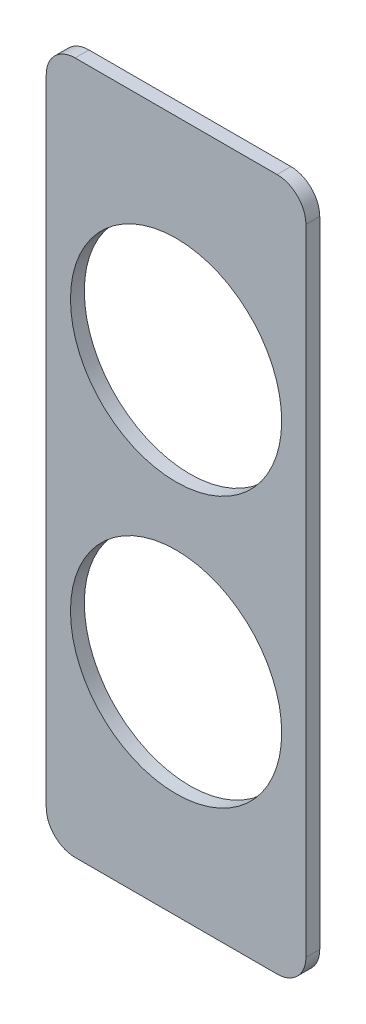
ISO-10303-21;
HEADER;
FILE_DESCRIPTION(('STEP AP214'),'2;1');
FILE_NAME('part.step','',(''),(''),'','','');
FILE_SCHEMA(('AUTOMOTIVE_DESIGN { 1 0 10303 214 1 1 1 1 }'));
ENDSEC;
DATA;
#1=APPLICATION_CONTEXT('core data for automotive mechanical design processes');
#2=APPLICATION_PROTOCOL_DEFINITION('international standard','automotive_design',2000,#1);
#3=PRODUCT_CONTEXT('',#1,'mechanical');
#4=PRODUCT('Part','Part','',(#3));
#5=PRODUCT_RELATED_PRODUCT_CATEGORY('part','',(#4));
#6=PRODUCT_DEFINITION_FORMATION('','',#4);
#7=PRODUCT_DEFINITION_CONTEXT('part definition',#1,'design');
#8=PRODUCT_DEFINITION('design','',#6,#7);
#9=PRODUCT_DEFINITION_SHAPE('','',#8);
#10=(LENGTH_UNIT() NAMED_UNIT(*) SI_UNIT(.MILLI.,.METRE.));
#11=(NAMED_UNIT(*) PLANE_ANGLE_UNIT() SI_UNIT($,.RADIAN.));
#12=(NAMED_UNIT(*) SI_UNIT($,.STERADIAN.) SOLID_ANGLE_UNIT());
#13=UNCERTAINTY_MEASURE_WITH_UNIT(LENGTH_MEASURE(1.E-05),#10,'distance_accuracy_value','');
#14=(GEOMETRIC_REPRESENTATION_CONTEXT(3) GLOBAL_UNCERTAINTY_ASSIGNED_CONTEXT((#13)) GLOBAL_UNIT_ASSIGNED_CONTEXT((#10,
#11,#12)) REPRESENTATION_CONTEXT('',''));
#15=CARTESIAN_POINT('',(0.,0.,0.));
#16=DIRECTION('',(0.,0.,1.));
#17=DIRECTION('',(1.,0.,0.));
#18=AXIS2_PLACEMENT_3D('',#15,#16,#17);
#19=CARTESIAN_POINT('',(-22.225,-69.85,-3.048));
#20=DIRECTION('',(0.,0.,1.));
#21=DIRECTION('',(1.,0.,0.));
#22=AXIS2_PLACEMENT_3D('',#19,#20,#21);
#23=CYLINDRICAL_SURFACE('',#22,6.35);
#24=CARTESIAN_POINT('',(-22.225,-69.85,0.));
#25=DIRECTION('',(0.,0.,1.));
#26=DIRECTION('',(1.,0.,0.));
#27=AXIS2_PLACEMENT_3D('',#24,#25,#26);
#28=CIRCLE('',#27,6.35);
#29=CARTESIAN_POINT('',(-28.575,-69.85,0.));
#30=VERTEX_POINT('',#29);
#31=CARTESIAN_POINT('',(-22.225,-76.2,0.));
#32=VERTEX_POINT('',#31);
#33=EDGE_CURVE('E137',#30,#32,#28,.T.);
#34=ORIENTED_EDGE('',*,*,#33,.F.);
#35=DIRECTION('',(0.,0.,1.));
#36=VECTOR('',#35,1.);
#37=CARTESIAN_POINT('',(-28.575,-69.85,-3.048));
#38=LINE('',#37,#36);
#39=CARTESIAN_POINT('',(-28.575,-69.85,-3.048));
#40=VERTEX_POINT('',#39);
#41=EDGE_CURVE('E11',#40,#30,#38,.T.);
#42=ORIENTED_EDGE('',*,*,#41,.F.);
#43=CARTESIAN_POINT('',(-22.225,-69.85,-3.048));
#44=DIRECTION('',(0.,0.,1.));
#45=DIRECTION('',(1.,0.,0.));
#46=AXIS2_PLACEMENT_3D('',#43,#44,#45);
#47=CIRCLE('',#46,6.35);
#48=CARTESIAN_POINT('',(-22.225,-76.2,-3.048));
#49=VERTEX_POINT('',#48);
#50=EDGE_CURVE('E157',#40,#49,#47,.T.);
#51=ORIENTED_EDGE('',*,*,#50,.T.);
#52=DIRECTION('',(0.,0.,1.));
#53=VECTOR('',#52,1.);
#54=CARTESIAN_POINT('',(-22.225,-76.2,-3.048));
#55=LINE('',#54,#53);
#56=EDGE_CURVE('E42',#49,#32,#55,.T.);
#57=ORIENTED_EDGE('',*,*,#56,.T.);
#58=EDGE_LOOP('',(#34,#42,#51,#57));
#59=FACE_BOUND('',#58,.T.);
#60=ADVANCED_FACE('F41',(#59),#23,.T.);
#61=CARTESIAN_POINT('',(-28.575,69.8499999999999,-3.048));
#62=DIRECTION('',(-1.,0.,0.));
#63=DIRECTION('',(0.,-1.,0.));
#64=AXIS2_PLACEMENT_3D('',#61,#62,#63);
#65=PLANE('',#64);
#66=DIRECTION('',(0.,-1.,0.));
#67=VECTOR('',#66,1.);
#68=CARTESIAN_POINT('',(-28.575,69.8499999999999,0.));
#69=LINE('',#68,#67);
#70=CARTESIAN_POINT('',(-28.575,69.8499999999999,0.));
#71=VERTEX_POINT('',#70);
#72=EDGE_CURVE('E160',#71,#30,#69,.T.);
#73=ORIENTED_EDGE('',*,*,#72,.F.);
#74=DIRECTION('',(0.,0.,1.));
#75=VECTOR('',#74,1.);
#76=CARTESIAN_POINT('',(-28.575,69.8499999999999,-3.048));
#77=LINE('',#76,#75);
#78=CARTESIAN_POINT('',(-28.575,69.8499999999999,-3.048));
#79=VERTEX_POINT('',#78);
#80=EDGE_CURVE('E49',#79,#71,#77,.T.);
#81=ORIENTED_EDGE('',*,*,#80,.F.);
#82=DIRECTION('',(0.,-1.,0.));
#83=VECTOR('',#82,1.);
#84=CARTESIAN_POINT('',(-28.575,69.8499999999999,-3.048));
#85=LINE('',#84,#83);
#86=EDGE_CURVE('E126',#79,#40,#85,.T.);
#87=ORIENTED_EDGE('',*,*,#86,.T.);
#88=ORIENTED_EDGE('',*,*,#41,.T.);
#89=EDGE_LOOP('',(#73,#81,#87,#88));
#90=FACE_BOUND('',#89,.T.);
#91=ADVANCED_FACE('F174',(#90),#65,.T.);
#92=CARTESIAN_POINT('',(-22.225,69.85,-3.048));
#93=DIRECTION('',(0.,0.,1.));
#94=DIRECTION('',(1.,0.,0.));
#95=AXIS2_PLACEMENT_3D('',#92,#93,#94);
#96=CYLINDRICAL_SURFACE('',#95,6.35);
#97=CARTESIAN_POINT('',(-22.225,69.85,0.));
#98=DIRECTION('',(0.,0.,1.));
#99=DIRECTION('',(-1.,0.,0.));
#100=AXIS2_PLACEMENT_3D('',#97,#98,#99);
#101=CIRCLE('',#100,6.35);
#102=CARTESIAN_POINT('',(-22.225,76.2,0.));
#103=VERTEX_POINT('',#102);
#104=EDGE_CURVE('E113',#103,#71,#101,.T.);
#105=ORIENTED_EDGE('',*,*,#104,.F.);
#106=DIRECTION('',(0.,0.,1.));
#107=VECTOR('',#106,1.);
#108=CARTESIAN_POINT('',(-22.225,76.2,-3.048));
#109=LINE('',#108,#107);
#110=CARTESIAN_POINT('',(-22.225,76.2,-3.048));
#111=VERTEX_POINT('',#110);
#112=EDGE_CURVE('E109',#111,#103,#109,.T.);
#113=ORIENTED_EDGE('',*,*,#112,.F.);
#114=CARTESIAN_POINT('',(-22.225,69.85,-3.048));
#115=DIRECTION('',(0.,0.,1.));
#116=DIRECTION('',(-1.,0.,0.));
#117=AXIS2_PLACEMENT_3D('',#114,#115,#116);
#118=CIRCLE('',#117,6.35);
#119=EDGE_CURVE('E114',#111,#79,#118,.T.);
#120=ORIENTED_EDGE('',*,*,#119,.T.);
#121=ORIENTED_EDGE('',*,*,#80,.T.);
#122=EDGE_LOOP('',(#105,#113,#120,#121));
#123=FACE_BOUND('',#122,.T.);
#124=ADVANCED_FACE('F115',(#123),#96,.T.);
#125=CARTESIAN_POINT('',(-22.225,76.2,-3.048));
#126=DIRECTION('',(0.,1.,0.));
#127=DIRECTION('',(0.,0.,1.));
#128=AXIS2_PLACEMENT_3D('',#125,#126,#127);
#129=PLANE('',#128);
#130=DIRECTION('',(-1.,0.,0.));
#131=VECTOR('',#130,1.);
#132=CARTESIAN_POINT('',(-22.225,76.2,0.));
#133=LINE('',#132,#131);
#134=CARTESIAN_POINT('',(22.2249999999999,76.2,0.));
#135=VERTEX_POINT('',#134);
#136=EDGE_CURVE('E152',#135,#103,#133,.T.);
#137=ORIENTED_EDGE('',*,*,#136,.F.);
#138=DIRECTION('',(0.,0.,1.));
#139=VECTOR('',#138,1.);
#140=CARTESIAN_POINT('',(22.2249999999999,76.2,-3.048));
#141=LINE('',#140,#139);
#142=CARTESIAN_POINT('',(22.2249999999999,76.2,-3.048));
#143=VERTEX_POINT('',#142);
#144=EDGE_CURVE('E117',#143,#135,#141,.T.);
#145=ORIENTED_EDGE('',*,*,#144,.F.);
#146=DIRECTION('',(-1.,0.,0.));
#147=VECTOR('',#146,1.);
#148=CARTESIAN_POINT('',(-22.225,76.2,-3.048));
#149=LINE('',#148,#147);
#150=EDGE_CURVE('E127',#143,#111,#149,.T.);
#151=ORIENTED_EDGE('',*,*,#150,.T.);
#152=ORIENTED_EDGE('',*,*,#112,.T.);
#153=EDGE_LOOP('',(#137,#145,#151,#152));
#154=FACE_BOUND('',#153,.T.);
#155=ADVANCED_FACE('F128',(#154),#129,.T.);
#156=CARTESIAN_POINT('',(22.225,69.85,-3.048));
#157=DIRECTION('',(0.,0.,1.));
#158=DIRECTION('',(1.,0.,0.));
#159=AXIS2_PLACEMENT_3D('',#156,#157,#158);
#160=CYLINDRICAL_SURFACE('',#159,6.35);
#161=CARTESIAN_POINT('',(22.225,69.85,0.));
#162=DIRECTION('',(0.,0.,1.));
#163=DIRECTION('',(1.,0.,0.));
#164=AXIS2_PLACEMENT_3D('',#161,#162,#163);
#165=CIRCLE('',#164,6.35);
#166=CARTESIAN_POINT('',(28.575,69.8499999999999,0.));
#167=VERTEX_POINT('',#166);
#168=EDGE_CURVE('E151',#167,#135,#165,.T.);
#169=ORIENTED_EDGE('',*,*,#168,.F.);
#170=DIRECTION('',(0.,0.,1.));
#171=VECTOR('',#170,1.);
#172=CARTESIAN_POINT('',(28.575,69.8499999999999,-3.048));
#173=LINE('',#172,#171);
#174=CARTESIAN_POINT('',(28.575,69.8499999999999,-3.048));
#175=VERTEX_POINT('',#174);
#176=EDGE_CURVE('E162',#175,#167,#173,.T.);
#177=ORIENTED_EDGE('',*,*,#176,.F.);
#178=CARTESIAN_POINT('',(22.225,69.85,-3.048));
#179=DIRECTION('',(0.,0.,1.));
#180=DIRECTION('',(1.,0.,0.));
#181=AXIS2_PLACEMENT_3D('',#178,#179,#180);
#182=CIRCLE('',#181,6.35);
#183=EDGE_CURVE('E134',#175,#143,#182,.T.);
#184=ORIENTED_EDGE('',*,*,#183,.T.);
#185=ORIENTED_EDGE('',*,*,#144,.T.);
#186=EDGE_LOOP('',(#169,#177,#184,#185));
#187=FACE_BOUND('',#186,.T.);
#188=ADVANCED_FACE('F184',(#187),#160,.T.);
#189=CARTESIAN_POINT('',(28.575,69.8499999999999,-3.048));
#190=DIRECTION('',(1.,0.,0.));
#191=DIRECTION('',(0.,1.,0.));
#192=AXIS2_PLACEMENT_3D('',#189,#190,#191);
#193=PLANE('',#192);
#194=DIRECTION('',(0.,1.,0.));
#195=VECTOR('',#194,1.);
#196=CARTESIAN_POINT('',(28.575,69.8499999999999,0.));
#197=LINE('',#196,#195);
#198=CARTESIAN_POINT('',(28.575,-69.85,0.));
#199=VERTEX_POINT('',#198);
#200=EDGE_CURVE('E146',#199,#167,#197,.T.);
#201=ORIENTED_EDGE('',*,*,#200,.F.);
#202=DIRECTION('',(0.,0.,1.));
#203=VECTOR('',#202,1.);
#204=CARTESIAN_POINT('',(28.575,-69.85,-3.048));
#205=LINE('',#204,#203);
#206=CARTESIAN_POINT('',(28.575,-69.85,-3.048));
#207=VERTEX_POINT('',#206);
#208=EDGE_CURVE('E164',#207,#199,#205,.T.);
#209=ORIENTED_EDGE('',*,*,#208,.F.);
#210=DIRECTION('',(0.,1.,0.));
#211=VECTOR('',#210,1.);
#212=CARTESIAN_POINT('',(28.575,69.8499999999999,-3.048));
#213=LINE('',#212,#211);
#214=EDGE_CURVE('E135',#207,#175,#213,.T.);
#215=ORIENTED_EDGE('',*,*,#214,.T.);
#216=ORIENTED_EDGE('',*,*,#176,.T.);
#217=EDGE_LOOP('',(#201,#209,#215,#216));
#218=FACE_BOUND('',#217,.T.);
#219=ADVANCED_FACE('F186',(#218),#193,.T.);
#220=CARTESIAN_POINT('',(22.225,-69.85,-3.048));
#221=DIRECTION('',(0.,0.,1.));
#222=DIRECTION('',(1.,0.,0.));
#223=AXIS2_PLACEMENT_3D('',#220,#221,#222);
#224=CYLINDRICAL_SURFACE('',#223,6.35);
#225=CARTESIAN_POINT('',(22.225,-69.85,0.));
#226=DIRECTION('',(0.,0.,1.));
#227=DIRECTION('',(-1.,0.,0.));
#228=AXIS2_PLACEMENT_3D('',#225,#226,#227);
#229=CIRCLE('',#228,6.35);
#230=CARTESIAN_POINT('',(22.225,-76.2,0.));
#231=VERTEX_POINT('',#230);
#232=EDGE_CURVE('E144',#231,#199,#229,.T.);
#233=ORIENTED_EDGE('',*,*,#232,.F.);
#234=DIRECTION('',(0.,0.,1.));
#235=VECTOR('',#234,1.);
#236=CARTESIAN_POINT('',(22.225,-76.2,-3.048));
#237=LINE('',#236,#235);
#238=CARTESIAN_POINT('',(22.225,-76.2,-3.048));
#239=VERTEX_POINT('',#238);
#240=EDGE_CURVE('E167',#239,#231,#237,.T.);
#241=ORIENTED_EDGE('',*,*,#240,.F.);
#242=CARTESIAN_POINT('',(22.225,-69.85,-3.048));
#243=DIRECTION('',(0.,0.,1.));
#244=DIRECTION('',(-1.,0.,0.));
#245=AXIS2_PLACEMENT_3D('',#242,#243,#244);
#246=CIRCLE('',#245,6.35);
#247=EDGE_CURVE('E232',#239,#207,#246,.T.);
#248=ORIENTED_EDGE('',*,*,#247,.T.);
#249=ORIENTED_EDGE('',*,*,#208,.T.);
#250=EDGE_LOOP('',(#233,#241,#248,#249));
#251=FACE_BOUND('',#250,.T.);
#252=ADVANCED_FACE('F191',(#251),#224,.T.);
#253=CARTESIAN_POINT('',(-22.225,-76.2,-3.048));
#254=DIRECTION('',(0.,-1.,0.));
#255=DIRECTION('',(0.,0.,-1.));
#256=AXIS2_PLACEMENT_3D('',#253,#254,#255);
#257=PLANE('',#256);
#258=DIRECTION('',(1.,0.,0.));
#259=VECTOR('',#258,1.);
#260=CARTESIAN_POINT('',(-22.225,-76.2,0.));
#261=LINE('',#260,#259);
#262=EDGE_CURVE('E143',#32,#231,#261,.T.);
#263=ORIENTED_EDGE('',*,*,#262,.F.);
#264=ORIENTED_EDGE('',*,*,#56,.F.);
#265=DIRECTION('',(1.,0.,0.));
#266=VECTOR('',#265,1.);
#267=CARTESIAN_POINT('',(-22.225,-76.2,-3.048));
#268=LINE('',#267,#266);
#269=EDGE_CURVE('E231',#49,#239,#268,.T.);
#270=ORIENTED_EDGE('',*,*,#269,.T.);
#271=ORIENTED_EDGE('',*,*,#240,.T.);
#272=EDGE_LOOP('',(#263,#264,#270,#271));
#273=FACE_BOUND('',#272,.T.);
#274=ADVANCED_FACE('F169',(#273),#257,.T.);
#275=CARTESIAN_POINT('',(-22.225,-69.85,-3.048));
#276=DIRECTION('',(0.,0.,1.));
#277=DIRECTION('',(1.,0.,0.));
#278=AXIS2_PLACEMENT_3D('',#275,#276,#277);
#279=PLANE('',#278);
#280=CARTESIAN_POINT('',(0.,-29.718,-3.048));
#281=DIRECTION('',(0.,0.,1.));
#282=DIRECTION('',(1.,0.,0.));
#283=AXIS2_PLACEMENT_3D('',#280,#281,#282);
#284=CIRCLE('',#283,23.241);
#285=CARTESIAN_POINT('',(23.241,-29.718,-3.048));
#286=VERTEX_POINT('',#285);
#287=EDGE_CURVE('E217',#286,#286,#284,.T.);
#288=ORIENTED_EDGE('',*,*,#287,.T.);
#289=EDGE_LOOP('',(#288));
#290=FACE_BOUND('',#289,.T.);
#291=CARTESIAN_POINT('',(0.,29.718,-3.048));
#292=DIRECTION('',(0.,0.,1.));
#293=DIRECTION('',(1.,0.,0.));
#294=AXIS2_PLACEMENT_3D('',#291,#292,#293);
#295=CIRCLE('',#294,23.241);
#296=CARTESIAN_POINT('',(23.241,29.718,-3.048));
#297=VERTEX_POINT('',#296);
#298=EDGE_CURVE('E142',#297,#297,#295,.T.);
#299=ORIENTED_EDGE('',*,*,#298,.T.);
#300=EDGE_LOOP('',(#299));
#301=FACE_BOUND('',#300,.T.);
#302=ORIENTED_EDGE('',*,*,#50,.F.);
#303=ORIENTED_EDGE('',*,*,#86,.F.);
#304=ORIENTED_EDGE('',*,*,#119,.F.);
#305=ORIENTED_EDGE('',*,*,#150,.F.);
#306=ORIENTED_EDGE('',*,*,#183,.F.);
#307=ORIENTED_EDGE('',*,*,#214,.F.);
#308=ORIENTED_EDGE('',*,*,#247,.F.);
#309=ORIENTED_EDGE('',*,*,#269,.F.);
#310=EDGE_LOOP('',(#302,#303,#304,#305,#306,#307,#308,#309));
#311=FACE_BOUND('',#310,.T.);
#312=ADVANCED_FACE('F123',(#290,#301,#311),#279,.F.);
#313=CARTESIAN_POINT('',(-22.225,-69.85,0.));
#314=DIRECTION('',(0.,0.,1.));
#315=DIRECTION('',(1.,0.,0.));
#316=AXIS2_PLACEMENT_3D('',#313,#314,#315);
#317=PLANE('',#316);
#318=CARTESIAN_POINT('',(0.,-29.718,0.));
#319=DIRECTION('',(0.,0.,1.));
#320=DIRECTION('',(1.,0.,0.));
#321=AXIS2_PLACEMENT_3D('',#318,#319,#320);
#322=CIRCLE('',#321,23.241);
#323=CARTESIAN_POINT('',(23.241,-29.718,0.));
#324=VERTEX_POINT('',#323);
#325=EDGE_CURVE('E222',#324,#324,#322,.T.);
#326=ORIENTED_EDGE('',*,*,#325,.F.);
#327=EDGE_LOOP('',(#326));
#328=FACE_BOUND('',#327,.T.);
#329=CARTESIAN_POINT('',(0.,29.718,0.));
#330=DIRECTION('',(0.,0.,1.));
#331=DIRECTION('',(1.,0.,0.));
#332=AXIS2_PLACEMENT_3D('',#329,#330,#331);
#333=CIRCLE('',#332,23.241);
#334=CARTESIAN_POINT('',(23.241,29.718,0.));
#335=VERTEX_POINT('',#334);
#336=EDGE_CURVE('E224',#335,#335,#333,.T.);
#337=ORIENTED_EDGE('',*,*,#336,.F.);
#338=EDGE_LOOP('',(#337));
#339=FACE_BOUND('',#338,.T.);
#340=ORIENTED_EDGE('',*,*,#33,.T.);
#341=ORIENTED_EDGE('',*,*,#262,.T.);
#342=ORIENTED_EDGE('',*,*,#232,.T.);
#343=ORIENTED_EDGE('',*,*,#200,.T.);
#344=ORIENTED_EDGE('',*,*,#168,.T.);
#345=ORIENTED_EDGE('',*,*,#136,.T.);
#346=ORIENTED_EDGE('',*,*,#104,.T.);
#347=ORIENTED_EDGE('',*,*,#72,.T.);
#348=EDGE_LOOP('',(#340,#341,#342,#343,#344,#345,#346,#347));
#349=FACE_BOUND('',#348,.T.);
#350=ADVANCED_FACE('F168',(#328,#339,#349),#317,.T.);
#351=CARTESIAN_POINT('',(0.,29.718,-3.048));
#352=DIRECTION('',(0.,0.,1.));
#353=DIRECTION('',(1.,0.,0.));
#354=AXIS2_PLACEMENT_3D('',#351,#352,#353);
#355=CYLINDRICAL_SURFACE('',#354,23.241);
#356=CARTESIAN_POINT('',(23.241,29.718,-3.048));
#357=CARTESIAN_POINT('',(23.241,29.718,-3.01625));
#358=CARTESIAN_POINT('',(23.241,29.718,-2.9845));
#359=CARTESIAN_POINT('',(23.241,29.718,-2.921));
#360=CARTESIAN_POINT('',(23.241,29.718,-2.88925));
#361=CARTESIAN_POINT('',(23.241,29.718,-2.82575));
#362=CARTESIAN_POINT('',(23.241,29.718,-2.794));
#363=CARTESIAN_POINT('',(23.241,29.718,-2.7305));
#364=CARTESIAN_POINT('',(23.241,29.718,-2.69875));
#365=CARTESIAN_POINT('',(23.241,29.718,-2.63525));
#366=CARTESIAN_POINT('',(23.241,29.718,-2.6035));
#367=CARTESIAN_POINT('',(23.241,29.718,-2.54));
#368=CARTESIAN_POINT('',(23.241,29.718,-2.50825));
#369=CARTESIAN_POINT('',(23.241,29.718,-2.44475));
#370=CARTESIAN_POINT('',(23.241,29.718,-2.413));
#371=CARTESIAN_POINT('',(23.241,29.718,-2.3495));
#372=CARTESIAN_POINT('',(23.241,29.718,-2.31775));
#373=CARTESIAN_POINT('',(23.241,29.718,-2.25425));
#374=CARTESIAN_POINT('',(23.241,29.718,-2.2225));
#375=CARTESIAN_POINT('',(23.241,29.718,-2.159));
#376=CARTESIAN_POINT('',(23.241,29.718,-2.12725));
#377=CARTESIAN_POINT('',(23.241,29.718,-2.06375));
#378=CARTESIAN_POINT('',(23.241,29.718,-2.032));
#379=CARTESIAN_POINT('',(23.241,29.718,-1.9685));
#380=CARTESIAN_POINT('',(23.241,29.718,-1.93675));
#381=CARTESIAN_POINT('',(23.241,29.718,-1.87325));
#382=CARTESIAN_POINT('',(23.241,29.718,-1.8415));
#383=CARTESIAN_POINT('',(23.241,29.718,-1.778));
#384=CARTESIAN_POINT('',(23.241,29.718,-1.74625));
#385=CARTESIAN_POINT('',(23.241,29.718,-1.68275));
#386=CARTESIAN_POINT('',(23.241,29.718,-1.651));
#387=CARTESIAN_POINT('',(23.241,29.718,-1.5875));
#388=CARTESIAN_POINT('',(23.241,29.718,-1.55575));
#389=CARTESIAN_POINT('',(23.241,29.718,-1.49225));
#390=CARTESIAN_POINT('',(23.241,29.718,-1.4605));
#391=CARTESIAN_POINT('',(23.241,29.718,-1.397));
#392=CARTESIAN_POINT('',(23.241,29.718,-1.36525));
#393=CARTESIAN_POINT('',(23.241,29.718,-1.30175));
#394=CARTESIAN_POINT('',(23.241,29.718,-1.27));
#395=CARTESIAN_POINT('',(23.241,29.718,-1.2065));
#396=CARTESIAN_POINT('',(23.241,29.718,-1.17475));
#397=CARTESIAN_POINT('',(23.241,29.718,-1.11125));
#398=CARTESIAN_POINT('',(23.241,29.718,-1.0795));
#399=CARTESIAN_POINT('',(23.241,29.718,-1.016));
#400=CARTESIAN_POINT('',(23.241,29.718,-0.98425));
#401=CARTESIAN_POINT('',(23.241,29.718,-0.92075));
#402=CARTESIAN_POINT('',(23.241,29.718,-0.889));
#403=CARTESIAN_POINT('',(23.241,29.718,-0.8255));
#404=CARTESIAN_POINT('',(23.241,29.718,-0.79375));
#405=CARTESIAN_POINT('',(23.241,29.718,-0.73025));
#406=CARTESIAN_POINT('',(23.241,29.718,-0.6985));
#407=CARTESIAN_POINT('',(23.241,29.718,-0.635));
#408=CARTESIAN_POINT('',(23.241,29.718,-0.60325));
#409=CARTESIAN_POINT('',(23.241,29.718,-0.53975));
#410=CARTESIAN_POINT('',(23.241,29.718,-0.508));
#411=CARTESIAN_POINT('',(23.241,29.718,-0.4445));
#412=CARTESIAN_POINT('',(23.241,29.718,-0.41275));
#413=CARTESIAN_POINT('',(23.241,29.718,-0.34925));
#414=CARTESIAN_POINT('',(23.241,29.718,-0.3175));
#415=CARTESIAN_POINT('',(23.241,29.718,-0.254));
#416=CARTESIAN_POINT('',(23.241,29.718,-0.22225));
#417=CARTESIAN_POINT('',(23.241,29.718,-0.15875));
#418=CARTESIAN_POINT('',(23.241,29.718,-0.127));
#419=CARTESIAN_POINT('',(23.241,29.718,-0.0634999999999999));
#420=CARTESIAN_POINT('',(23.241,29.718,-0.03175));
#421=CARTESIAN_POINT('',(23.241,29.718,0.));
#422=B_SPLINE_CURVE_WITH_KNOTS('',3,(#356,#357,#358,#359,#360,#361,#362,#363,#364,#365,#366,
#367,#368,#369,#370,#371,#372,#373,#374,#375,#376,#377,#378,#379,#380,#381,#382,#383,#384,#385,
#386,#387,#388,#389,#390,#391,#392,#393,#394,#395,#396,#397,#398,#399,#400,#401,#402,#403,#404,
#405,#406,#407,#408,#409,#410,#411,#412,#413,#414,#415,#416,#417,#418,#419,#420,#421),
.UNSPECIFIED.,.F.,.F.,(4,2,2,2,2,2,2,2,2,2,2,2,2,2,2,2,2,2,2,2,2,2,2,2,2,2,2,2,2,2,2,2,4),(0.,
0.0952499999999998,0.1905,0.28575,0.381,0.47625,0.5715,0.66675,0.762,0.85725,0.9525,1.04775,
1.143,1.23825,1.3335,1.42875,1.524,1.61925,1.7145,1.80975,1.905,2.00025,2.0955,2.19075,2.286,
2.38125,2.4765,2.57175,2.667,2.76225,2.8575,2.95275,3.048),.UNSPECIFIED.);
#423=EDGE_CURVE('BSEAM201',#297,#335,#422,.T.);
#424=ORIENTED_EDGE('',*,*,#298,.F.);
#425=ORIENTED_EDGE('',*,*,#336,.T.);
#426=ORIENTED_EDGE('',*,*,#423,.T.);
#427=ORIENTED_EDGE('',*,*,#423,.F.);
#428=EDGE_LOOP('',(#424,#426,#425,#427));
#429=FACE_BOUND('',#428,.T.);
#430=ADVANCED_FACE('F201',(#429),#355,.F.);
#431=CARTESIAN_POINT('',(0.,-29.718,-3.048));
#432=DIRECTION('',(0.,0.,1.));
#433=DIRECTION('',(1.,0.,0.));
#434=AXIS2_PLACEMENT_3D('',#431,#432,#433);
#435=CYLINDRICAL_SURFACE('',#434,23.241);
#436=CARTESIAN_POINT('',(23.241,-29.718,-3.048));
#437=CARTESIAN_POINT('',(23.241,-29.718,-3.01625));
#438=CARTESIAN_POINT('',(23.241,-29.718,-2.9845));
#439=CARTESIAN_POINT('',(23.241,-29.718,-2.921));
#440=CARTESIAN_POINT('',(23.241,-29.718,-2.88925));
#441=CARTESIAN_POINT('',(23.241,-29.718,-2.82575));
#442=CARTESIAN_POINT('',(23.241,-29.718,-2.794));
#443=CARTESIAN_POINT('',(23.241,-29.718,-2.7305));
#444=CARTESIAN_POINT('',(23.241,-29.718,-2.69875));
#445=CARTESIAN_POINT('',(23.241,-29.718,-2.63525));
#446=CARTESIAN_POINT('',(23.241,-29.718,-2.6035));
#447=CARTESIAN_POINT('',(23.241,-29.718,-2.54));
#448=CARTESIAN_POINT('',(23.241,-29.718,-2.50825));
#449=CARTESIAN_POINT('',(23.241,-29.718,-2.44475));
#450=CARTESIAN_POINT('',(23.241,-29.718,-2.413));
#451=CARTESIAN_POINT('',(23.241,-29.718,-2.3495));
#452=CARTESIAN_POINT('',(23.241,-29.718,-2.31775));
#453=CARTESIAN_POINT('',(23.241,-29.718,-2.25425));
#454=CARTESIAN_POINT('',(23.241,-29.718,-2.2225));
#455=CARTESIAN_POINT('',(23.241,-29.718,-2.159));
#456=CARTESIAN_POINT('',(23.241,-29.718,-2.12725));
#457=CARTESIAN_POINT('',(23.241,-29.718,-2.06375));
#458=CARTESIAN_POINT('',(23.241,-29.718,-2.032));
#459=CARTESIAN_POINT('',(23.241,-29.718,-1.9685));
#460=CARTESIAN_POINT('',(23.241,-29.718,-1.93675));
#461=CARTESIAN_POINT('',(23.241,-29.718,-1.87325));
#462=CARTESIAN_POINT('',(23.241,-29.718,-1.8415));
#463=CARTESIAN_POINT('',(23.241,-29.718,-1.778));
#464=CARTESIAN_POINT('',(23.241,-29.718,-1.74625));
#465=CARTESIAN_POINT('',(23.241,-29.718,-1.68275));
#466=CARTESIAN_POINT('',(23.241,-29.718,-1.651));
#467=CARTESIAN_POINT('',(23.241,-29.718,-1.5875));
#468=CARTESIAN_POINT('',(23.241,-29.718,-1.55575));
#469=CARTESIAN_POINT('',(23.241,-29.718,-1.49225));
#470=CARTESIAN_POINT('',(23.241,-29.718,-1.4605));
#471=CARTESIAN_POINT('',(23.241,-29.718,-1.397));
#472=CARTESIAN_POINT('',(23.241,-29.718,-1.36525));
#473=CARTESIAN_POINT('',(23.241,-29.718,-1.30175));
#474=CARTESIAN_POINT('',(23.241,-29.718,-1.27));
#475=CARTESIAN_POINT('',(23.241,-29.718,-1.2065));
#476=CARTESIAN_POINT('',(23.241,-29.718,-1.17475));
#477=CARTESIAN_POINT('',(23.241,-29.718,-1.11125));
#478=CARTESIAN_POINT('',(23.241,-29.718,-1.0795));
#479=CARTESIAN_POINT('',(23.241,-29.718,-1.016));
#480=CARTESIAN_POINT('',(23.241,-29.718,-0.98425));
#481=CARTESIAN_POINT('',(23.241,-29.718,-0.92075));
#482=CARTESIAN_POINT('',(23.241,-29.718,-0.889));
#483=CARTESIAN_POINT('',(23.241,-29.718,-0.8255));
#484=CARTESIAN_POINT('',(23.241,-29.718,-0.79375));
#485=CARTESIAN_POINT('',(23.241,-29.718,-0.73025));
#486=CARTESIAN_POINT('',(23.241,-29.718,-0.6985));
#487=CARTESIAN_POINT('',(23.241,-29.718,-0.635));
#488=CARTESIAN_POINT('',(23.241,-29.718,-0.60325));
#489=CARTESIAN_POINT('',(23.241,-29.718,-0.53975));
#490=CARTESIAN_POINT('',(23.241,-29.718,-0.508));
#491=CARTESIAN_POINT('',(23.241,-29.718,-0.4445));
#492=CARTESIAN_POINT('',(23.241,-29.718,-0.41275));
#493=CARTESIAN_POINT('',(23.241,-29.718,-0.34925));
#494=CARTESIAN_POINT('',(23.241,-29.718,-0.3175));
#495=CARTESIAN_POINT('',(23.241,-29.718,-0.254));
#496=CARTESIAN_POINT('',(23.241,-29.718,-0.22225));
#497=CARTESIAN_POINT('',(23.241,-29.718,-0.15875));
#498=CARTESIAN_POINT('',(23.241,-29.718,-0.127));
#499=CARTESIAN_POINT('',(23.241,-29.718,-0.0634999999999999));
#500=CARTESIAN_POINT('',(23.241,-29.718,-0.03175));
#501=CARTESIAN_POINT('',(23.241,-29.718,0.));
#502=B_SPLINE_CURVE_WITH_KNOTS('',3,(#436,#437,#438,#439,#440,#441,#442,#443,#444,#445,#446,
#447,#448,#449,#450,#451,#452,#453,#454,#455,#456,#457,#458,#459,#460,#461,#462,#463,#464,#465,
#466,#467,#468,#469,#470,#471,#472,#473,#474,#475,#476,#477,#478,#479,#480,#481,#482,#483,#484,
#485,#486,#487,#488,#489,#490,#491,#492,#493,#494,#495,#496,#497,#498,#499,#500,#501),
.UNSPECIFIED.,.F.,.F.,(4,2,2,2,2,2,2,2,2,2,2,2,2,2,2,2,2,2,2,2,2,2,2,2,2,2,2,2,2,2,2,2,4),(0.,
0.0952499999999998,0.1905,0.28575,0.381,0.47625,0.5715,0.66675,0.762,0.85725,0.9525,1.04775,
1.143,1.23825,1.3335,1.42875,1.524,1.61925,1.7145,1.80975,1.905,2.00025,2.0955,2.19075,2.286,
2.38125,2.4765,2.57175,2.667,2.76225,2.8575,2.95275,3.048),.UNSPECIFIED.);
#503=EDGE_CURVE('BSEAM209',#286,#324,#502,.T.);
#504=ORIENTED_EDGE('',*,*,#287,.F.);
#505=ORIENTED_EDGE('',*,*,#325,.T.);
#506=ORIENTED_EDGE('',*,*,#503,.T.);
#507=ORIENTED_EDGE('',*,*,#503,.F.);
#508=EDGE_LOOP('',(#504,#506,#505,#507));
#509=FACE_BOUND('',#508,.T.);
#510=ADVANCED_FACE('F209',(#509),#435,.F.);
#511=CLOSED_SHELL('',(#60,#91,#124,#155,#188,#219,#252,#274,#312,#350,#430,#510));
#512=MANIFOLD_SOLID_BREP('B2',#511);
#513=ADVANCED_BREP_SHAPE_REPRESENTATION('',(#18,#512),#14);
#514=SHAPE_DEFINITION_REPRESENTATION(#9,#513);
ENDSEC;
END-ISO-10303-21;
